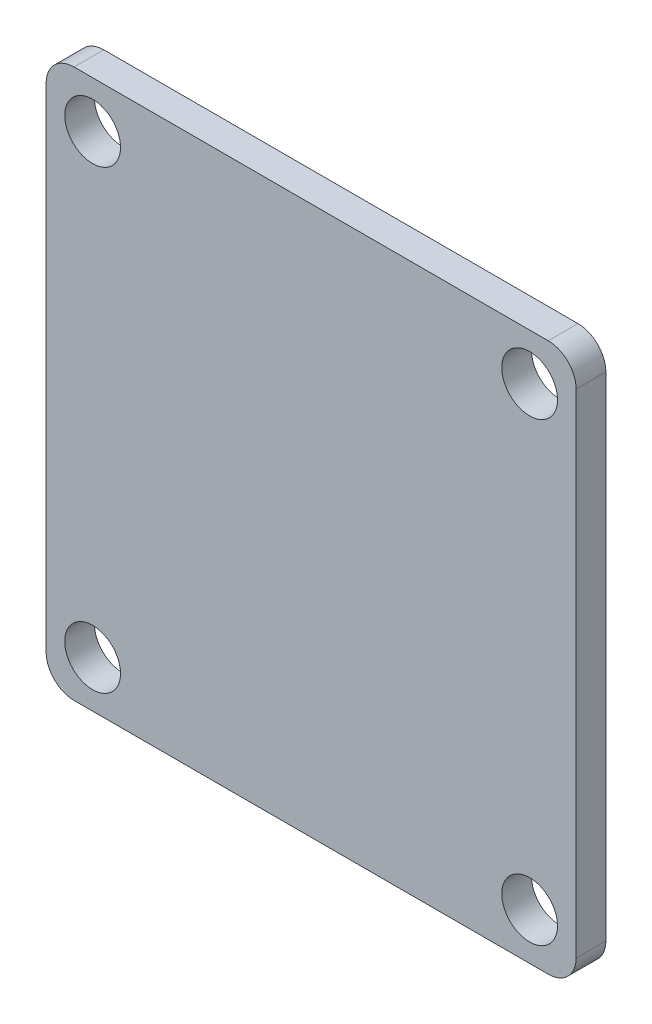
ISO-10303-21;
HEADER;
FILE_DESCRIPTION(('STEP AP214'),'2;1');
FILE_NAME('part.step','',(''),(''),'','','');
FILE_SCHEMA(('AUTOMOTIVE_DESIGN { 1 0 10303 214 1 1 1 1 }'));
ENDSEC;
DATA;
#1=APPLICATION_CONTEXT('core data for automotive mechanical design processes');
#2=APPLICATION_PROTOCOL_DEFINITION('international standard','automotive_design',2000,#1);
#3=PRODUCT_CONTEXT('',#1,'mechanical');
#4=PRODUCT('Part','Part','',(#3));
#5=PRODUCT_RELATED_PRODUCT_CATEGORY('part','',(#4));
#6=PRODUCT_DEFINITION_FORMATION('','',#4);
#7=PRODUCT_DEFINITION_CONTEXT('part definition',#1,'design');
#8=PRODUCT_DEFINITION('design','',#6,#7);
#9=PRODUCT_DEFINITION_SHAPE('','',#8);
#10=(LENGTH_UNIT() NAMED_UNIT(*) SI_UNIT(.MILLI.,.METRE.));
#11=(NAMED_UNIT(*) PLANE_ANGLE_UNIT() SI_UNIT($,.RADIAN.));
#12=(NAMED_UNIT(*) SI_UNIT($,.STERADIAN.) SOLID_ANGLE_UNIT());
#13=UNCERTAINTY_MEASURE_WITH_UNIT(LENGTH_MEASURE(1.E-05),#10,'distance_accuracy_value','');
#14=(GEOMETRIC_REPRESENTATION_CONTEXT(3) GLOBAL_UNCERTAINTY_ASSIGNED_CONTEXT((#13)) GLOBAL_UNIT_ASSIGNED_CONTEXT((#10,
#11,#12)) REPRESENTATION_CONTEXT('',''));
#15=CARTESIAN_POINT('',(0.,0.,0.));
#16=DIRECTION('',(0.,0.,1.));
#17=DIRECTION('',(1.,0.,0.));
#18=AXIS2_PLACEMENT_3D('',#15,#16,#17);
#19=CARTESIAN_POINT('',(0.,0.,1.6));
#20=DIRECTION('',(0.,0.,-1.));
#21=DIRECTION('',(-1.,0.,0.));
#22=AXIS2_PLACEMENT_3D('',#19,#20,#21);
#23=PLANE('',#22);
#24=DIRECTION('',(-1.,0.,0.));
#25=VECTOR('',#24,1.);
#26=CARTESIAN_POINT('',(2.5,29.5,1.6));
#27=LINE('',#26,#25);
#28=CARTESIAN_POINT('',(27.,29.5,1.6));
#29=VERTEX_POINT('',#28);
#30=CARTESIAN_POINT('',(1.5,29.5,1.6));
#31=VERTEX_POINT('',#30);
#32=EDGE_CURVE('E138',#29,#31,#27,.T.);
#33=ORIENTED_EDGE('',*,*,#32,.T.);
#34=CARTESIAN_POINT('',(1.5,28.,1.6));
#35=DIRECTION('',(0.,0.,-1.));
#36=DIRECTION('',(-1.,0.,0.));
#37=AXIS2_PLACEMENT_3D('',#34,#35,#36);
#38=CIRCLE('',#37,1.5);
#39=CARTESIAN_POINT('',(0.,28.,1.6));
#40=VERTEX_POINT('',#39);
#41=EDGE_CURVE('E157',#31,#40,#38,.F.);
#42=ORIENTED_EDGE('',*,*,#41,.T.);
#43=DIRECTION('',(0.,-1.,0.));
#44=VECTOR('',#43,1.);
#45=CARTESIAN_POINT('',(0.,0.,1.6));
#46=LINE('',#45,#44);
#47=CARTESIAN_POINT('',(0.,1.5,1.6));
#48=VERTEX_POINT('',#47);
#49=EDGE_CURVE('E121',#40,#48,#46,.T.);
#50=ORIENTED_EDGE('',*,*,#49,.T.);
#51=CARTESIAN_POINT('',(1.5,1.5,1.6));
#52=DIRECTION('',(0.,0.,-1.));
#53=DIRECTION('',(-1.,0.,0.));
#54=AXIS2_PLACEMENT_3D('',#51,#52,#53);
#55=CIRCLE('',#54,1.5);
#56=CARTESIAN_POINT('',(1.5,0.,1.6));
#57=VERTEX_POINT('',#56);
#58=EDGE_CURVE('E155',#48,#57,#55,.F.);
#59=ORIENTED_EDGE('',*,*,#58,.T.);
#60=DIRECTION('',(1.,0.,0.));
#61=VECTOR('',#60,1.);
#62=CARTESIAN_POINT('',(0.,0.,1.6));
#63=LINE('',#62,#61);
#64=CARTESIAN_POINT('',(27.,0.,1.6));
#65=VERTEX_POINT('',#64);
#66=EDGE_CURVE('E168',#57,#65,#63,.T.);
#67=ORIENTED_EDGE('',*,*,#66,.T.);
#68=CARTESIAN_POINT('',(27.,1.5,1.6));
#69=DIRECTION('',(0.,0.,-1.));
#70=DIRECTION('',(-1.,0.,0.));
#71=AXIS2_PLACEMENT_3D('',#68,#69,#70);
#72=CIRCLE('',#71,1.5);
#73=CARTESIAN_POINT('',(28.5,1.5,1.6));
#74=VERTEX_POINT('',#73);
#75=EDGE_CURVE('E56',#65,#74,#72,.F.);
#76=ORIENTED_EDGE('',*,*,#75,.T.);
#77=DIRECTION('',(0.,1.,0.));
#78=VECTOR('',#77,1.);
#79=CARTESIAN_POINT('',(28.5,29.5,1.6));
#80=LINE('',#79,#78);
#81=CARTESIAN_POINT('',(28.5,28.,1.6));
#82=VERTEX_POINT('',#81);
#83=EDGE_CURVE('E176',#74,#82,#80,.T.);
#84=ORIENTED_EDGE('',*,*,#83,.T.);
#85=CARTESIAN_POINT('',(27.,28.,1.6));
#86=DIRECTION('',(0.,0.,-1.));
#87=DIRECTION('',(-1.,0.,0.));
#88=AXIS2_PLACEMENT_3D('',#85,#86,#87);
#89=CIRCLE('',#88,1.5);
#90=EDGE_CURVE('E152',#82,#29,#89,.F.);
#91=ORIENTED_EDGE('',*,*,#90,.T.);
#92=EDGE_LOOP('',(#33,#42,#50,#59,#67,#76,#84,#91));
#93=FACE_BOUND('',#92,.T.);
#94=CARTESIAN_POINT('',(2.5,27.,1.6));
#95=DIRECTION('',(0.,0.,1.));
#96=DIRECTION('',(1.,0.,0.));
#97=AXIS2_PLACEMENT_3D('',#94,#95,#96);
#98=CIRCLE('',#97,1.5);
#99=CARTESIAN_POINT('',(4.,27.,1.6));
#100=VERTEX_POINT('',#99);
#101=EDGE_CURVE('E129',#100,#100,#98,.T.);
#102=ORIENTED_EDGE('',*,*,#101,.F.);
#103=EDGE_LOOP('',(#102));
#104=FACE_BOUND('',#103,.T.);
#105=CARTESIAN_POINT('',(26.,27.,1.6));
#106=DIRECTION('',(0.,0.,1.));
#107=DIRECTION('',(1.,0.,0.));
#108=AXIS2_PLACEMENT_3D('',#105,#106,#107);
#109=CIRCLE('',#108,1.5);
#110=CARTESIAN_POINT('',(27.5,27.,1.6));
#111=VERTEX_POINT('',#110);
#112=EDGE_CURVE('E183',#111,#111,#109,.T.);
#113=ORIENTED_EDGE('',*,*,#112,.F.);
#114=EDGE_LOOP('',(#113));
#115=FACE_BOUND('',#114,.T.);
#116=CARTESIAN_POINT('',(26.,2.5,1.6));
#117=DIRECTION('',(0.,0.,1.));
#118=DIRECTION('',(1.,0.,0.));
#119=AXIS2_PLACEMENT_3D('',#116,#117,#118);
#120=CIRCLE('',#119,1.5);
#121=CARTESIAN_POINT('',(27.5,2.5,1.6));
#122=VERTEX_POINT('',#121);
#123=EDGE_CURVE('E188',#122,#122,#120,.T.);
#124=ORIENTED_EDGE('',*,*,#123,.F.);
#125=EDGE_LOOP('',(#124));
#126=FACE_BOUND('',#125,.T.);
#127=CARTESIAN_POINT('',(2.5,2.5,1.6));
#128=DIRECTION('',(0.,0.,1.));
#129=DIRECTION('',(1.,0.,0.));
#130=AXIS2_PLACEMENT_3D('',#127,#128,#129);
#131=CIRCLE('',#130,1.5);
#132=CARTESIAN_POINT('',(4.,2.5,1.6));
#133=VERTEX_POINT('',#132);
#134=EDGE_CURVE('E194',#133,#133,#131,.T.);
#135=ORIENTED_EDGE('',*,*,#134,.F.);
#136=EDGE_LOOP('',(#135));
#137=FACE_BOUND('',#136,.T.);
#138=ADVANCED_FACE('F35',(#93,#104,#115,#126,#137),#23,.F.);
#139=CARTESIAN_POINT('',(0.,0.,0.));
#140=DIRECTION('',(0.,0.,-1.));
#141=DIRECTION('',(-1.,0.,0.));
#142=AXIS2_PLACEMENT_3D('',#139,#140,#141);
#143=PLANE('',#142);
#144=CARTESIAN_POINT('',(26.,2.5,0.));
#145=DIRECTION('',(0.,0.,1.));
#146=DIRECTION('',(1.,0.,0.));
#147=AXIS2_PLACEMENT_3D('',#144,#145,#146);
#148=CIRCLE('',#147,1.5);
#149=CARTESIAN_POINT('',(27.5,2.5,0.));
#150=VERTEX_POINT('',#149);
#151=EDGE_CURVE('E191',#150,#150,#148,.T.);
#152=ORIENTED_EDGE('',*,*,#151,.T.);
#153=EDGE_LOOP('',(#152));
#154=FACE_BOUND('',#153,.T.);
#155=CARTESIAN_POINT('',(2.5,27.,0.));
#156=DIRECTION('',(0.,0.,1.));
#157=DIRECTION('',(1.,0.,0.));
#158=AXIS2_PLACEMENT_3D('',#155,#156,#157);
#159=CIRCLE('',#158,1.5);
#160=CARTESIAN_POINT('',(4.,27.,0.));
#161=VERTEX_POINT('',#160);
#162=EDGE_CURVE('E135',#161,#161,#159,.T.);
#163=ORIENTED_EDGE('',*,*,#162,.T.);
#164=EDGE_LOOP('',(#163));
#165=FACE_BOUND('',#164,.T.);
#166=DIRECTION('',(0.,-1.,0.));
#167=VECTOR('',#166,1.);
#168=CARTESIAN_POINT('',(0.,0.,0.));
#169=LINE('',#168,#167);
#170=CARTESIAN_POINT('',(0.,28.,0.));
#171=VERTEX_POINT('',#170);
#172=CARTESIAN_POINT('',(0.,1.5,0.));
#173=VERTEX_POINT('',#172);
#174=EDGE_CURVE('E118',#171,#173,#169,.T.);
#175=ORIENTED_EDGE('',*,*,#174,.F.);
#176=CARTESIAN_POINT('',(1.5,28.,0.));
#177=DIRECTION('',(0.,0.,-1.));
#178=DIRECTION('',(-1.,0.,0.));
#179=AXIS2_PLACEMENT_3D('',#176,#177,#178);
#180=CIRCLE('',#179,1.5);
#181=CARTESIAN_POINT('',(1.5,29.5,0.));
#182=VERTEX_POINT('',#181);
#183=EDGE_CURVE('E101',#171,#182,#180,.T.);
#184=ORIENTED_EDGE('',*,*,#183,.T.);
#185=DIRECTION('',(-1.,0.,0.));
#186=VECTOR('',#185,1.);
#187=CARTESIAN_POINT('',(0.,29.5,0.));
#188=LINE('',#187,#186);
#189=CARTESIAN_POINT('',(27.,29.5,0.));
#190=VERTEX_POINT('',#189);
#191=EDGE_CURVE('E142',#190,#182,#188,.T.);
#192=ORIENTED_EDGE('',*,*,#191,.F.);
#193=CARTESIAN_POINT('',(27.,28.,0.));
#194=DIRECTION('',(0.,0.,-1.));
#195=DIRECTION('',(-1.,0.,0.));
#196=AXIS2_PLACEMENT_3D('',#193,#194,#195);
#197=CIRCLE('',#196,1.5);
#198=CARTESIAN_POINT('',(28.5,28.,0.));
#199=VERTEX_POINT('',#198);
#200=EDGE_CURVE('E122',#190,#199,#197,.T.);
#201=ORIENTED_EDGE('',*,*,#200,.T.);
#202=DIRECTION('',(0.,1.,0.));
#203=VECTOR('',#202,1.);
#204=CARTESIAN_POINT('',(28.5,29.5,0.));
#205=LINE('',#204,#203);
#206=CARTESIAN_POINT('',(28.5,1.5,0.));
#207=VERTEX_POINT('',#206);
#208=EDGE_CURVE('E132',#207,#199,#205,.T.);
#209=ORIENTED_EDGE('',*,*,#208,.F.);
#210=CARTESIAN_POINT('',(27.,1.5,0.));
#211=DIRECTION('',(0.,0.,-1.));
#212=DIRECTION('',(-1.,0.,0.));
#213=AXIS2_PLACEMENT_3D('',#210,#211,#212);
#214=CIRCLE('',#213,1.5);
#215=CARTESIAN_POINT('',(27.,0.,0.));
#216=VERTEX_POINT('',#215);
#217=EDGE_CURVE('E146',#207,#216,#214,.T.);
#218=ORIENTED_EDGE('',*,*,#217,.T.);
#219=DIRECTION('',(1.,0.,0.));
#220=VECTOR('',#219,1.);
#221=CARTESIAN_POINT('',(0.,0.,0.));
#222=LINE('',#221,#220);
#223=CARTESIAN_POINT('',(1.5,0.,0.));
#224=VERTEX_POINT('',#223);
#225=EDGE_CURVE('E128',#224,#216,#222,.T.);
#226=ORIENTED_EDGE('',*,*,#225,.F.);
#227=CARTESIAN_POINT('',(1.5,1.5,0.));
#228=DIRECTION('',(0.,0.,-1.));
#229=DIRECTION('',(-1.,0.,0.));
#230=AXIS2_PLACEMENT_3D('',#227,#228,#229);
#231=CIRCLE('',#230,1.5);
#232=EDGE_CURVE('E112',#224,#173,#231,.T.);
#233=ORIENTED_EDGE('',*,*,#232,.T.);
#234=EDGE_LOOP('',(#175,#184,#192,#201,#209,#218,#226,#233));
#235=FACE_BOUND('',#234,.T.);
#236=CARTESIAN_POINT('',(26.,27.,0.));
#237=DIRECTION('',(0.,0.,1.));
#238=DIRECTION('',(1.,0.,0.));
#239=AXIS2_PLACEMENT_3D('',#236,#237,#238);
#240=CIRCLE('',#239,1.5);
#241=CARTESIAN_POINT('',(27.5,27.,0.));
#242=VERTEX_POINT('',#241);
#243=EDGE_CURVE('E185',#242,#242,#240,.T.);
#244=ORIENTED_EDGE('',*,*,#243,.T.);
#245=EDGE_LOOP('',(#244));
#246=FACE_BOUND('',#245,.T.);
#247=CARTESIAN_POINT('',(2.5,2.5,0.));
#248=DIRECTION('',(0.,0.,1.));
#249=DIRECTION('',(1.,0.,0.));
#250=AXIS2_PLACEMENT_3D('',#247,#248,#249);
#251=CIRCLE('',#250,1.5);
#252=CARTESIAN_POINT('',(4.,2.5,0.));
#253=VERTEX_POINT('',#252);
#254=EDGE_CURVE('E197',#253,#253,#251,.T.);
#255=ORIENTED_EDGE('',*,*,#254,.T.);
#256=EDGE_LOOP('',(#255));
#257=FACE_BOUND('',#256,.T.);
#258=ADVANCED_FACE('F125',(#154,#165,#235,#246,#257),#143,.T.);
#259=CARTESIAN_POINT('',(0.,0.,1.6));
#260=DIRECTION('',(1.,0.,0.));
#261=DIRECTION('',(0.,0.,-1.));
#262=AXIS2_PLACEMENT_3D('',#259,#260,#261);
#263=PLANE('',#262);
#264=ORIENTED_EDGE('',*,*,#49,.F.);
#265=DIRECTION('',(0.,0.,-1.));
#266=VECTOR('',#265,1.);
#267=CARTESIAN_POINT('',(0.,28.,1.6));
#268=LINE('',#267,#266);
#269=EDGE_CURVE('E105',#40,#171,#268,.T.);
#270=ORIENTED_EDGE('',*,*,#269,.T.);
#271=ORIENTED_EDGE('',*,*,#174,.T.);
#272=DIRECTION('',(0.,0.,-1.));
#273=VECTOR('',#272,1.);
#274=CARTESIAN_POINT('',(0.,1.5,1.6));
#275=LINE('',#274,#273);
#276=EDGE_CURVE('E123',#173,#48,#275,.F.);
#277=ORIENTED_EDGE('',*,*,#276,.T.);
#278=EDGE_LOOP('',(#264,#270,#271,#277));
#279=FACE_BOUND('',#278,.T.);
#280=ADVANCED_FACE('F117',(#279),#263,.F.);
#281=CARTESIAN_POINT('',(0.,0.,1.6));
#282=DIRECTION('',(0.,1.,0.));
#283=DIRECTION('',(0.,0.,1.));
#284=AXIS2_PLACEMENT_3D('',#281,#282,#283);
#285=PLANE('',#284);
#286=ORIENTED_EDGE('',*,*,#66,.F.);
#287=DIRECTION('',(0.,0.,-1.));
#288=VECTOR('',#287,1.);
#289=CARTESIAN_POINT('',(1.5,0.,1.6));
#290=LINE('',#289,#288);
#291=EDGE_CURVE('E161',#57,#224,#290,.T.);
#292=ORIENTED_EDGE('',*,*,#291,.T.);
#293=ORIENTED_EDGE('',*,*,#225,.T.);
#294=DIRECTION('',(0.,0.,-1.));
#295=VECTOR('',#294,1.);
#296=CARTESIAN_POINT('',(27.,0.,1.6));
#297=LINE('',#296,#295);
#298=EDGE_CURVE('E159',#216,#65,#297,.F.);
#299=ORIENTED_EDGE('',*,*,#298,.T.);
#300=EDGE_LOOP('',(#286,#292,#293,#299));
#301=FACE_BOUND('',#300,.T.);
#302=ADVANCED_FACE('F166',(#301),#285,.F.);
#303=CARTESIAN_POINT('',(28.5,29.5,1.6));
#304=DIRECTION('',(-1.,0.,0.));
#305=DIRECTION('',(0.,0.,1.));
#306=AXIS2_PLACEMENT_3D('',#303,#304,#305);
#307=PLANE('',#306);
#308=ORIENTED_EDGE('',*,*,#83,.F.);
#309=DIRECTION('',(0.,0.,-1.));
#310=VECTOR('',#309,1.);
#311=CARTESIAN_POINT('',(28.5,1.5,1.6));
#312=LINE('',#311,#310);
#313=EDGE_CURVE('E11',#74,#207,#312,.T.);
#314=ORIENTED_EDGE('',*,*,#313,.T.);
#315=ORIENTED_EDGE('',*,*,#208,.T.);
#316=DIRECTION('',(0.,0.,-1.));
#317=VECTOR('',#316,1.);
#318=CARTESIAN_POINT('',(28.5,28.,1.6));
#319=LINE('',#318,#317);
#320=EDGE_CURVE('E43',#199,#82,#319,.F.);
#321=ORIENTED_EDGE('',*,*,#320,.T.);
#322=EDGE_LOOP('',(#308,#314,#315,#321));
#323=FACE_BOUND('',#322,.T.);
#324=ADVANCED_FACE('F175',(#323),#307,.F.);
#325=CARTESIAN_POINT('',(0.,29.5,1.6));
#326=DIRECTION('',(0.,-1.,0.));
#327=DIRECTION('',(0.,0.,-1.));
#328=AXIS2_PLACEMENT_3D('',#325,#326,#327);
#329=PLANE('',#328);
#330=ORIENTED_EDGE('',*,*,#191,.T.);
#331=DIRECTION('',(0.,0.,-1.));
#332=VECTOR('',#331,1.);
#333=CARTESIAN_POINT('',(1.5,29.5,1.6));
#334=LINE('',#333,#332);
#335=EDGE_CURVE('E106',#182,#31,#334,.F.);
#336=ORIENTED_EDGE('',*,*,#335,.T.);
#337=ORIENTED_EDGE('',*,*,#32,.F.);
#338=DIRECTION('',(0.,0.,-1.));
#339=VECTOR('',#338,1.);
#340=CARTESIAN_POINT('',(27.,29.5,1.6));
#341=LINE('',#340,#339);
#342=EDGE_CURVE('E111',#29,#190,#341,.T.);
#343=ORIENTED_EDGE('',*,*,#342,.T.);
#344=EDGE_LOOP('',(#330,#336,#337,#343));
#345=FACE_BOUND('',#344,.T.);
#346=ADVANCED_FACE('F218',(#345),#329,.F.);
#347=CARTESIAN_POINT('',(2.5,27.,1.6));
#348=DIRECTION('',(0.,0.,-1.));
#349=DIRECTION('',(-1.,0.,0.));
#350=AXIS2_PLACEMENT_3D('',#347,#348,#349);
#351=CYLINDRICAL_SURFACE('',#350,1.5);
#352=ORIENTED_EDGE('',*,*,#101,.T.);
#353=EDGE_LOOP('',(#352));
#354=FACE_BOUND('',#353,.T.);
#355=ORIENTED_EDGE('',*,*,#162,.F.);
#356=EDGE_LOOP('',(#355));
#357=FACE_BOUND('',#356,.T.);
#358=ADVANCED_FACE('F215',(#354,#357),#351,.F.);
#359=CARTESIAN_POINT('',(26.,27.,1.6));
#360=DIRECTION('',(0.,0.,-1.));
#361=DIRECTION('',(-1.,0.,0.));
#362=AXIS2_PLACEMENT_3D('',#359,#360,#361);
#363=CYLINDRICAL_SURFACE('',#362,1.5);
#364=ORIENTED_EDGE('',*,*,#112,.T.);
#365=EDGE_LOOP('',(#364));
#366=FACE_BOUND('',#365,.T.);
#367=ORIENTED_EDGE('',*,*,#243,.F.);
#368=EDGE_LOOP('',(#367));
#369=FACE_BOUND('',#368,.T.);
#370=ADVANCED_FACE('F312',(#366,#369),#363,.F.);
#371=CARTESIAN_POINT('',(26.,2.5,1.6));
#372=DIRECTION('',(0.,0.,-1.));
#373=DIRECTION('',(-1.,0.,0.));
#374=AXIS2_PLACEMENT_3D('',#371,#372,#373);
#375=CYLINDRICAL_SURFACE('',#374,1.5);
#376=ORIENTED_EDGE('',*,*,#123,.T.);
#377=EDGE_LOOP('',(#376));
#378=FACE_BOUND('',#377,.T.);
#379=ORIENTED_EDGE('',*,*,#151,.F.);
#380=EDGE_LOOP('',(#379));
#381=FACE_BOUND('',#380,.T.);
#382=ADVANCED_FACE('F303',(#378,#381),#375,.F.);
#383=CARTESIAN_POINT('',(2.5,2.5,1.6));
#384=DIRECTION('',(0.,0.,-1.));
#385=DIRECTION('',(-1.,0.,0.));
#386=AXIS2_PLACEMENT_3D('',#383,#384,#385);
#387=CYLINDRICAL_SURFACE('',#386,1.5);
#388=ORIENTED_EDGE('',*,*,#134,.T.);
#389=EDGE_LOOP('',(#388));
#390=FACE_BOUND('',#389,.T.);
#391=ORIENTED_EDGE('',*,*,#254,.F.);
#392=EDGE_LOOP('',(#391));
#393=FACE_BOUND('',#392,.T.);
#394=ADVANCED_FACE('F203',(#390,#393),#387,.F.);
#395=CARTESIAN_POINT('',(1.5,28.,1.6));
#396=DIRECTION('',(0.,0.,-1.));
#397=DIRECTION('',(-1.,0.,0.));
#398=AXIS2_PLACEMENT_3D('',#395,#396,#397);
#399=CYLINDRICAL_SURFACE('',#398,1.5);
#400=ORIENTED_EDGE('',*,*,#41,.F.);
#401=ORIENTED_EDGE('',*,*,#335,.F.);
#402=ORIENTED_EDGE('',*,*,#183,.F.);
#403=ORIENTED_EDGE('',*,*,#269,.F.);
#404=EDGE_LOOP('',(#400,#401,#402,#403));
#405=FACE_BOUND('',#404,.T.);
#406=ADVANCED_FACE('F104',(#405),#399,.T.);
#407=CARTESIAN_POINT('',(1.5,1.5,1.6));
#408=DIRECTION('',(0.,0.,-1.));
#409=DIRECTION('',(-1.,0.,0.));
#410=AXIS2_PLACEMENT_3D('',#407,#408,#409);
#411=CYLINDRICAL_SURFACE('',#410,1.5);
#412=ORIENTED_EDGE('',*,*,#58,.F.);
#413=ORIENTED_EDGE('',*,*,#276,.F.);
#414=ORIENTED_EDGE('',*,*,#232,.F.);
#415=ORIENTED_EDGE('',*,*,#291,.F.);
#416=EDGE_LOOP('',(#412,#413,#414,#415));
#417=FACE_BOUND('',#416,.T.);
#418=ADVANCED_FACE('F230',(#417),#411,.T.);
#419=CARTESIAN_POINT('',(27.,1.5,1.6));
#420=DIRECTION('',(0.,0.,-1.));
#421=DIRECTION('',(-1.,0.,0.));
#422=AXIS2_PLACEMENT_3D('',#419,#420,#421);
#423=CYLINDRICAL_SURFACE('',#422,1.5);
#424=ORIENTED_EDGE('',*,*,#75,.F.);
#425=ORIENTED_EDGE('',*,*,#298,.F.);
#426=ORIENTED_EDGE('',*,*,#217,.F.);
#427=ORIENTED_EDGE('',*,*,#313,.F.);
#428=EDGE_LOOP('',(#424,#425,#426,#427));
#429=FACE_BOUND('',#428,.T.);
#430=ADVANCED_FACE('F174',(#429),#423,.T.);
#431=CARTESIAN_POINT('',(27.,28.,1.6));
#432=DIRECTION('',(0.,0.,-1.));
#433=DIRECTION('',(-1.,0.,0.));
#434=AXIS2_PLACEMENT_3D('',#431,#432,#433);
#435=CYLINDRICAL_SURFACE('',#434,1.5);
#436=ORIENTED_EDGE('',*,*,#90,.F.);
#437=ORIENTED_EDGE('',*,*,#320,.F.);
#438=ORIENTED_EDGE('',*,*,#200,.F.);
#439=ORIENTED_EDGE('',*,*,#342,.F.);
#440=EDGE_LOOP('',(#436,#437,#438,#439));
#441=FACE_BOUND('',#440,.T.);
#442=ADVANCED_FACE('F37',(#441),#435,.T.);
#443=CLOSED_SHELL('',(#138,#258,#280,#302,#324,#346,#358,#370,#382,#394,#406,#418,#430,#442));
#444=MANIFOLD_SOLID_BREP('B2',#443);
#445=ADVANCED_BREP_SHAPE_REPRESENTATION('',(#18,#444),#14);
#446=SHAPE_DEFINITION_REPRESENTATION(#9,#445);
ENDSEC;
END-ISO-10303-21;
